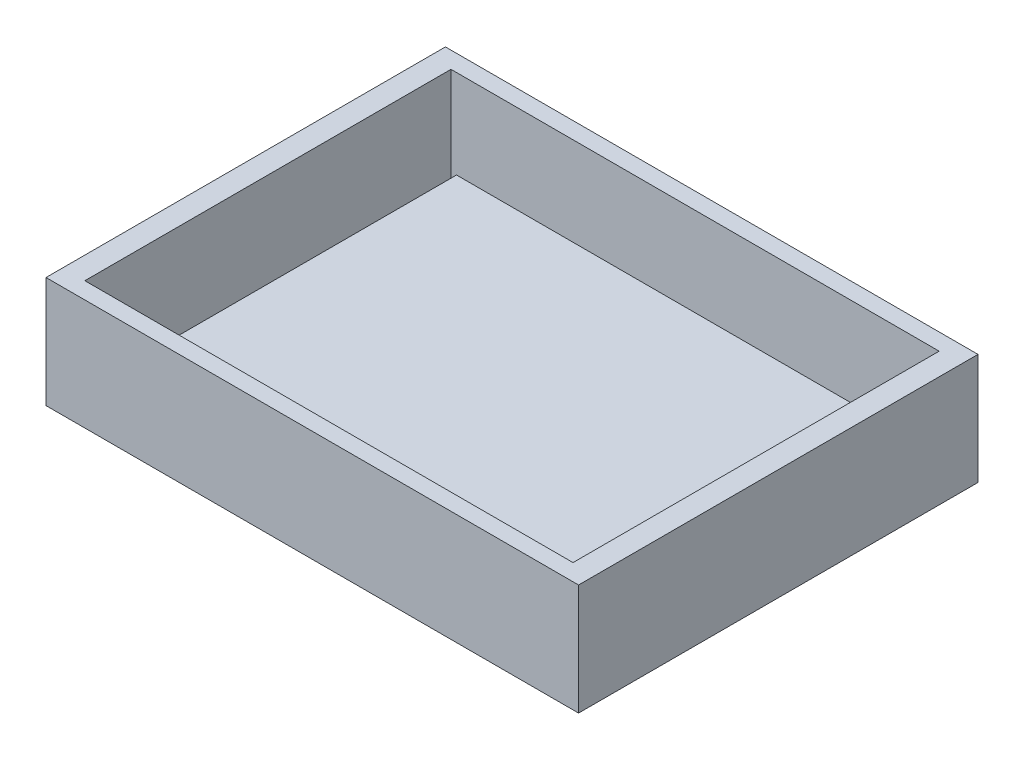
ISO-10303-21;
HEADER;
FILE_DESCRIPTION(('STEP AP214'),'2;1');
FILE_NAME('part.step','',(''),(''),'','','');
FILE_SCHEMA(('AUTOMOTIVE_DESIGN { 1 0 10303 214 1 1 1 1 }'));
ENDSEC;
DATA;
#1=APPLICATION_CONTEXT('core data for automotive mechanical design processes');
#2=APPLICATION_PROTOCOL_DEFINITION('international standard','automotive_design',2000,#1);
#3=PRODUCT_CONTEXT('',#1,'mechanical');
#4=PRODUCT('Part','Part','',(#3));
#5=PRODUCT_RELATED_PRODUCT_CATEGORY('part','',(#4));
#6=PRODUCT_DEFINITION_FORMATION('','',#4);
#7=PRODUCT_DEFINITION_CONTEXT('part definition',#1,'design');
#8=PRODUCT_DEFINITION('design','',#6,#7);
#9=PRODUCT_DEFINITION_SHAPE('','',#8);
#10=(LENGTH_UNIT() NAMED_UNIT(*) SI_UNIT(.MILLI.,.METRE.));
#11=(NAMED_UNIT(*) PLANE_ANGLE_UNIT() SI_UNIT($,.RADIAN.));
#12=(NAMED_UNIT(*) SI_UNIT($,.STERADIAN.) SOLID_ANGLE_UNIT());
#13=UNCERTAINTY_MEASURE_WITH_UNIT(LENGTH_MEASURE(1.E-05),#10,'distance_accuracy_value','');
#14=(GEOMETRIC_REPRESENTATION_CONTEXT(3) GLOBAL_UNCERTAINTY_ASSIGNED_CONTEXT((#13)) GLOBAL_UNIT_ASSIGNED_CONTEXT((#10,
#11,#12)) REPRESENTATION_CONTEXT('',''));
#15=CARTESIAN_POINT('',(0.,0.,0.));
#16=DIRECTION('',(0.,0.,1.));
#17=DIRECTION('',(1.,0.,0.));
#18=AXIS2_PLACEMENT_3D('',#15,#16,#17);
#19=CARTESIAN_POINT('',(0.,2.,0.));
#20=DIRECTION('',(0.,1.,0.));
#21=DIRECTION('',(0.,0.,1.));
#22=AXIS2_PLACEMENT_3D('',#19,#20,#21);
#23=PLANE('',#22);
#24=DIRECTION('',(0.,0.,1.));
#25=VECTOR('',#24,1.);
#26=CARTESIAN_POINT('',(-38.1666666666666,2.,-35.4444444444444));
#27=LINE('',#26,#25);
#28=CARTESIAN_POINT('',(-38.1666666666666,2.,-35.4444444444444));
#29=VERTEX_POINT('',#28);
#30=CARTESIAN_POINT('',(-38.1666666666666,2.,30.5555555555556));
#31=VERTEX_POINT('',#30);
#32=EDGE_CURVE('E156',#29,#31,#27,.T.);
#33=ORIENTED_EDGE('',*,*,#32,.T.);
#34=DIRECTION('',(1.,0.,0.));
#35=VECTOR('',#34,1.);
#36=CARTESIAN_POINT('',(-38.1666666666666,2.,30.5555555555556));
#37=LINE('',#36,#35);
#38=CARTESIAN_POINT('',(49.8333333333334,2.,30.5555555555556));
#39=VERTEX_POINT('',#38);
#40=EDGE_CURVE('E159',#31,#39,#37,.T.);
#41=ORIENTED_EDGE('',*,*,#40,.T.);
#42=DIRECTION('',(0.,0.,-1.));
#43=VECTOR('',#42,1.);
#44=CARTESIAN_POINT('',(49.8333333333334,2.,-35.4444444444444));
#45=LINE('',#44,#43);
#46=CARTESIAN_POINT('',(49.8333333333334,2.,-35.4444444444444));
#47=VERTEX_POINT('',#46);
#48=EDGE_CURVE('E163',#39,#47,#45,.T.);
#49=ORIENTED_EDGE('',*,*,#48,.T.);
#50=DIRECTION('',(-1.,0.,0.));
#51=VECTOR('',#50,1.);
#52=CARTESIAN_POINT('',(-38.1666666666666,2.,-35.4444444444444));
#53=LINE('',#52,#51);
#54=EDGE_CURVE('E166',#47,#29,#53,.T.);
#55=ORIENTED_EDGE('',*,*,#54,.T.);
#56=EDGE_LOOP('',(#33,#41,#49,#55));
#57=FACE_BOUND('',#56,.T.);
#58=DIRECTION('',(1.,0.,0.));
#59=VECTOR('',#58,1.);
#60=CARTESIAN_POINT('',(-34.1666666666666,2.,27.5555555555556));
#61=LINE('',#60,#59);
#62=CARTESIAN_POINT('',(-34.1666666666666,2.,27.5555555555556));
#63=VERTEX_POINT('',#62);
#64=CARTESIAN_POINT('',(45.8333333333334,2.,27.5555555555556));
#65=VERTEX_POINT('',#64);
#66=EDGE_CURVE('E377',#63,#65,#61,.T.);
#67=ORIENTED_EDGE('',*,*,#66,.F.);
#68=DIRECTION('',(0.,0.,1.));
#69=VECTOR('',#68,1.);
#70=CARTESIAN_POINT('',(-34.1666666666666,2.,-32.4444444444444));
#71=LINE('',#70,#69);
#72=CARTESIAN_POINT('',(-34.1666666666666,2.,-32.4444444444444));
#73=VERTEX_POINT('',#72);
#74=EDGE_CURVE('E148',#73,#63,#71,.T.);
#75=ORIENTED_EDGE('',*,*,#74,.F.);
#76=DIRECTION('',(-1.,0.,0.));
#77=VECTOR('',#76,1.);
#78=CARTESIAN_POINT('',(-34.1666666666666,2.,-32.4444444444444));
#79=LINE('',#78,#77);
#80=CARTESIAN_POINT('',(45.8333333333334,2.,-32.4444444444444));
#81=VERTEX_POINT('',#80);
#82=EDGE_CURVE('E144',#81,#73,#79,.T.);
#83=ORIENTED_EDGE('',*,*,#82,.F.);
#84=DIRECTION('',(0.,0.,-1.));
#85=VECTOR('',#84,1.);
#86=CARTESIAN_POINT('',(45.8333333333334,2.,-32.4444444444444));
#87=LINE('',#86,#85);
#88=EDGE_CURVE('E374',#65,#81,#87,.T.);
#89=ORIENTED_EDGE('',*,*,#88,.F.);
#90=EDGE_LOOP('',(#67,#75,#83,#89));
#91=FACE_BOUND('',#90,.T.);
#92=ADVANCED_FACE('F35',(#57,#91),#23,.T.);
#93=CARTESIAN_POINT('',(-42.1666666666666,20.,33.5555555555555));
#94=DIRECTION('',(-1.,0.,0.));
#95=DIRECTION('',(0.,0.,1.));
#96=AXIS2_PLACEMENT_3D('',#93,#94,#95);
#97=PLANE('',#96);
#98=DIRECTION('',(0.,0.,-1.));
#99=VECTOR('',#98,1.);
#100=CARTESIAN_POINT('',(-42.1666666666666,0.,33.5555555555555));
#101=LINE('',#100,#99);
#102=CARTESIAN_POINT('',(-42.1666666666666,0.,33.5555555555555));
#103=VERTEX_POINT('',#102);
#104=CARTESIAN_POINT('',(-42.1666666666666,0.,-38.4444444444445));
#105=VERTEX_POINT('',#104);
#106=EDGE_CURVE('E179',#103,#105,#101,.T.);
#107=ORIENTED_EDGE('',*,*,#106,.F.);
#108=DIRECTION('',(0.,-1.,0.));
#109=VECTOR('',#108,1.);
#110=CARTESIAN_POINT('',(-42.1666666666666,20.,33.5555555555555));
#111=LINE('',#110,#109);
#112=CARTESIAN_POINT('',(-42.1666666666666,20.,33.5555555555555));
#113=VERTEX_POINT('',#112);
#114=EDGE_CURVE('E11',#113,#103,#111,.T.);
#115=ORIENTED_EDGE('',*,*,#114,.F.);
#116=DIRECTION('',(0.,0.,-1.));
#117=VECTOR('',#116,1.);
#118=CARTESIAN_POINT('',(-42.1666666666666,20.,33.5555555555555));
#119=LINE('',#118,#117);
#120=CARTESIAN_POINT('',(-42.1666666666666,20.,-38.4444444444445));
#121=VERTEX_POINT('',#120);
#122=EDGE_CURVE('E185',#113,#121,#119,.T.);
#123=ORIENTED_EDGE('',*,*,#122,.T.);
#124=DIRECTION('',(0.,-1.,0.));
#125=VECTOR('',#124,1.);
#126=CARTESIAN_POINT('',(-42.1666666666666,20.,-38.4444444444445));
#127=LINE('',#126,#125);
#128=EDGE_CURVE('E39',#121,#105,#127,.T.);
#129=ORIENTED_EDGE('',*,*,#128,.T.);
#130=EDGE_LOOP('',(#107,#115,#123,#129));
#131=FACE_BOUND('',#130,.T.);
#132=ADVANCED_FACE('F212',(#131),#97,.T.);
#133=CARTESIAN_POINT('',(-42.1666666666666,20.,33.5555555555555));
#134=DIRECTION('',(0.,0.,-1.));
#135=DIRECTION('',(-1.,0.,0.));
#136=AXIS2_PLACEMENT_3D('',#133,#134,#135);
#137=PLANE('',#136);
#138=DIRECTION('',(1.,0.,0.));
#139=VECTOR('',#138,1.);
#140=CARTESIAN_POINT('',(-42.1666666666666,0.,33.5555555555555));
#141=LINE('',#140,#139);
#142=CARTESIAN_POINT('',(53.8333333333334,0.,33.5555555555555));
#143=VERTEX_POINT('',#142);
#144=EDGE_CURVE('E189',#103,#143,#141,.T.);
#145=ORIENTED_EDGE('',*,*,#144,.T.);
#146=DIRECTION('',(0.,-1.,0.));
#147=VECTOR('',#146,1.);
#148=CARTESIAN_POINT('',(53.8333333333334,20.,33.5555555555555));
#149=LINE('',#148,#147);
#150=CARTESIAN_POINT('',(53.8333333333334,20.,33.5555555555555));
#151=VERTEX_POINT('',#150);
#152=EDGE_CURVE('E44',#151,#143,#149,.T.);
#153=ORIENTED_EDGE('',*,*,#152,.F.);
#154=DIRECTION('',(1.,0.,0.));
#155=VECTOR('',#154,1.);
#156=CARTESIAN_POINT('',(-42.1666666666666,20.,33.5555555555555));
#157=LINE('',#156,#155);
#158=EDGE_CURVE('E194',#113,#151,#157,.T.);
#159=ORIENTED_EDGE('',*,*,#158,.F.);
#160=ORIENTED_EDGE('',*,*,#114,.T.);
#161=EDGE_LOOP('',(#145,#153,#159,#160));
#162=FACE_BOUND('',#161,.T.);
#163=ADVANCED_FACE('F221',(#162),#137,.F.);
#164=CARTESIAN_POINT('',(53.8333333333334,20.,33.5555555555555));
#165=DIRECTION('',(-1.,0.,0.));
#166=DIRECTION('',(0.,0.,1.));
#167=AXIS2_PLACEMENT_3D('',#164,#165,#166);
#168=PLANE('',#167);
#169=DIRECTION('',(0.,0.,-1.));
#170=VECTOR('',#169,1.);
#171=CARTESIAN_POINT('',(53.8333333333334,0.,33.5555555555555));
#172=LINE('',#171,#170);
#173=CARTESIAN_POINT('',(53.8333333333334,0.,-38.4444444444445));
#174=VERTEX_POINT('',#173);
#175=EDGE_CURVE('E201',#143,#174,#172,.T.);
#176=ORIENTED_EDGE('',*,*,#175,.T.);
#177=DIRECTION('',(0.,-1.,0.));
#178=VECTOR('',#177,1.);
#179=CARTESIAN_POINT('',(53.8333333333334,20.,-38.4444444444445));
#180=LINE('',#179,#178);
#181=CARTESIAN_POINT('',(53.8333333333334,20.,-38.4444444444445));
#182=VERTEX_POINT('',#181);
#183=EDGE_CURVE('E206',#182,#174,#180,.T.);
#184=ORIENTED_EDGE('',*,*,#183,.F.);
#185=DIRECTION('',(0.,0.,-1.));
#186=VECTOR('',#185,1.);
#187=CARTESIAN_POINT('',(53.8333333333334,20.,33.5555555555555));
#188=LINE('',#187,#186);
#189=EDGE_CURVE('E192',#151,#182,#188,.T.);
#190=ORIENTED_EDGE('',*,*,#189,.F.);
#191=ORIENTED_EDGE('',*,*,#152,.T.);
#192=EDGE_LOOP('',(#176,#184,#190,#191));
#193=FACE_BOUND('',#192,.T.);
#194=ADVANCED_FACE('F225',(#193),#168,.F.);
#195=CARTESIAN_POINT('',(-42.1666666666666,20.,-38.4444444444445));
#196=DIRECTION('',(0.,0.,-1.));
#197=DIRECTION('',(-1.,0.,0.));
#198=AXIS2_PLACEMENT_3D('',#195,#196,#197);
#199=PLANE('',#198);
#200=DIRECTION('',(1.,0.,0.));
#201=VECTOR('',#200,1.);
#202=CARTESIAN_POINT('',(-42.1666666666666,0.,-38.4444444444445));
#203=LINE('',#202,#201);
#204=EDGE_CURVE('E198',#105,#174,#203,.T.);
#205=ORIENTED_EDGE('',*,*,#204,.F.);
#206=ORIENTED_EDGE('',*,*,#128,.F.);
#207=DIRECTION('',(1.,0.,0.));
#208=VECTOR('',#207,1.);
#209=CARTESIAN_POINT('',(-42.1666666666666,20.,-38.4444444444445));
#210=LINE('',#209,#208);
#211=EDGE_CURVE('E188',#121,#182,#210,.T.);
#212=ORIENTED_EDGE('',*,*,#211,.T.);
#213=ORIENTED_EDGE('',*,*,#183,.T.);
#214=EDGE_LOOP('',(#205,#206,#212,#213));
#215=FACE_BOUND('',#214,.T.);
#216=ADVANCED_FACE('F215',(#215),#199,.T.);
#217=CARTESIAN_POINT('',(0.,20.,0.));
#218=DIRECTION('',(0.,-1.,0.));
#219=DIRECTION('',(0.,0.,-1.));
#220=AXIS2_PLACEMENT_3D('',#217,#218,#219);
#221=PLANE('',#220);
#222=DIRECTION('',(1.,0.,0.));
#223=VECTOR('',#222,1.);
#224=CARTESIAN_POINT('',(-38.1666666666666,20.,30.5555555555556));
#225=LINE('',#224,#223);
#226=CARTESIAN_POINT('',(-38.1666666666666,20.,30.5555555555556));
#227=VERTEX_POINT('',#226);
#228=CARTESIAN_POINT('',(49.8333333333334,20.,30.5555555555556));
#229=VERTEX_POINT('',#228);
#230=EDGE_CURVE('E151',#227,#229,#225,.T.);
#231=ORIENTED_EDGE('',*,*,#230,.F.);
#232=DIRECTION('',(0.,0.,1.));
#233=VECTOR('',#232,1.);
#234=CARTESIAN_POINT('',(-38.1666666666666,20.,-35.4444444444444));
#235=LINE('',#234,#233);
#236=CARTESIAN_POINT('',(-38.1666666666666,20.,-35.4444444444444));
#237=VERTEX_POINT('',#236);
#238=EDGE_CURVE('E60',#237,#227,#235,.T.);
#239=ORIENTED_EDGE('',*,*,#238,.F.);
#240=DIRECTION('',(-1.,0.,0.));
#241=VECTOR('',#240,1.);
#242=CARTESIAN_POINT('',(-38.1666666666666,20.,-35.4444444444444));
#243=LINE('',#242,#241);
#244=CARTESIAN_POINT('',(49.8333333333334,20.,-35.4444444444444));
#245=VERTEX_POINT('',#244);
#246=EDGE_CURVE('E160',#245,#237,#243,.T.);
#247=ORIENTED_EDGE('',*,*,#246,.F.);
#248=DIRECTION('',(0.,0.,-1.));
#249=VECTOR('',#248,1.);
#250=CARTESIAN_POINT('',(49.8333333333334,20.,-35.4444444444444));
#251=LINE('',#250,#249);
#252=EDGE_CURVE('E172',#229,#245,#251,.T.);
#253=ORIENTED_EDGE('',*,*,#252,.F.);
#254=EDGE_LOOP('',(#231,#239,#247,#253));
#255=FACE_BOUND('',#254,.T.);
#256=ORIENTED_EDGE('',*,*,#122,.F.);
#257=ORIENTED_EDGE('',*,*,#158,.T.);
#258=ORIENTED_EDGE('',*,*,#189,.T.);
#259=ORIENTED_EDGE('',*,*,#211,.F.);
#260=EDGE_LOOP('',(#256,#257,#258,#259));
#261=FACE_BOUND('',#260,.T.);
#262=ADVANCED_FACE('F227',(#255,#261),#221,.F.);
#263=CARTESIAN_POINT('',(0.,0.,0.));
#264=DIRECTION('',(0.,1.,0.));
#265=DIRECTION('',(0.,0.,1.));
#266=AXIS2_PLACEMENT_3D('',#263,#264,#265);
#267=PLANE('',#266);
#268=ORIENTED_EDGE('',*,*,#106,.T.);
#269=ORIENTED_EDGE('',*,*,#204,.T.);
#270=ORIENTED_EDGE('',*,*,#175,.F.);
#271=ORIENTED_EDGE('',*,*,#144,.F.);
#272=EDGE_LOOP('',(#268,#269,#270,#271));
#273=FACE_BOUND('',#272,.T.);
#274=ADVANCED_FACE('F37',(#273),#267,.F.);
#275=CARTESIAN_POINT('',(-38.1666666666666,2.,-35.4444444444444));
#276=DIRECTION('',(-1.,0.,0.));
#277=DIRECTION('',(0.,0.,1.));
#278=AXIS2_PLACEMENT_3D('',#275,#276,#277);
#279=PLANE('',#278);
#280=ORIENTED_EDGE('',*,*,#238,.T.);
#281=DIRECTION('',(0.,1.,0.));
#282=VECTOR('',#281,1.);
#283=CARTESIAN_POINT('',(-38.1666666666666,2.,30.5555555555556));
#284=LINE('',#283,#282);
#285=EDGE_CURVE('E168',#31,#227,#284,.T.);
#286=ORIENTED_EDGE('',*,*,#285,.F.);
#287=ORIENTED_EDGE('',*,*,#32,.F.);
#288=DIRECTION('',(0.,1.,0.));
#289=VECTOR('',#288,1.);
#290=CARTESIAN_POINT('',(-38.1666666666666,2.,-35.4444444444444));
#291=LINE('',#290,#289);
#292=EDGE_CURVE('E177',#29,#237,#291,.T.);
#293=ORIENTED_EDGE('',*,*,#292,.T.);
#294=EDGE_LOOP('',(#280,#286,#287,#293));
#295=FACE_BOUND('',#294,.T.);
#296=ADVANCED_FACE('F235',(#295),#279,.F.);
#297=CARTESIAN_POINT('',(-38.1666666666666,2.,-35.4444444444444));
#298=DIRECTION('',(0.,0.,-1.));
#299=DIRECTION('',(-1.,0.,0.));
#300=AXIS2_PLACEMENT_3D('',#297,#298,#299);
#301=PLANE('',#300);
#302=ORIENTED_EDGE('',*,*,#246,.T.);
#303=ORIENTED_EDGE('',*,*,#292,.F.);
#304=ORIENTED_EDGE('',*,*,#54,.F.);
#305=DIRECTION('',(0.,1.,0.));
#306=VECTOR('',#305,1.);
#307=CARTESIAN_POINT('',(49.8333333333334,2.,-35.4444444444444));
#308=LINE('',#307,#306);
#309=EDGE_CURVE('E180',#47,#245,#308,.T.);
#310=ORIENTED_EDGE('',*,*,#309,.T.);
#311=EDGE_LOOP('',(#302,#303,#304,#310));
#312=FACE_BOUND('',#311,.T.);
#313=ADVANCED_FACE('F250',(#312),#301,.F.);
#314=CARTESIAN_POINT('',(49.8333333333334,2.,-35.4444444444444));
#315=DIRECTION('',(1.,0.,0.));
#316=DIRECTION('',(0.,0.,-1.));
#317=AXIS2_PLACEMENT_3D('',#314,#315,#316);
#318=PLANE('',#317);
#319=ORIENTED_EDGE('',*,*,#252,.T.);
#320=ORIENTED_EDGE('',*,*,#309,.F.);
#321=ORIENTED_EDGE('',*,*,#48,.F.);
#322=DIRECTION('',(0.,1.,0.));
#323=VECTOR('',#322,1.);
#324=CARTESIAN_POINT('',(49.8333333333334,2.,30.5555555555556));
#325=LINE('',#324,#323);
#326=EDGE_CURVE('E182',#39,#229,#325,.T.);
#327=ORIENTED_EDGE('',*,*,#326,.T.);
#328=EDGE_LOOP('',(#319,#320,#321,#327));
#329=FACE_BOUND('',#328,.T.);
#330=ADVANCED_FACE('F253',(#329),#318,.F.);
#331=CARTESIAN_POINT('',(-38.1666666666666,2.,30.5555555555556));
#332=DIRECTION('',(0.,0.,1.));
#333=DIRECTION('',(1.,0.,0.));
#334=AXIS2_PLACEMENT_3D('',#331,#332,#333);
#335=PLANE('',#334);
#336=ORIENTED_EDGE('',*,*,#230,.T.);
#337=ORIENTED_EDGE('',*,*,#326,.F.);
#338=ORIENTED_EDGE('',*,*,#40,.F.);
#339=ORIENTED_EDGE('',*,*,#285,.T.);
#340=EDGE_LOOP('',(#336,#337,#338,#339));
#341=FACE_BOUND('',#340,.T.);
#342=ADVANCED_FACE('F257',(#341),#335,.F.);
#343=CARTESIAN_POINT('',(-34.1666666666666,7.,-32.4444444444444));
#344=DIRECTION('',(1.,0.,0.));
#345=DIRECTION('',(0.,0.,-1.));
#346=AXIS2_PLACEMENT_3D('',#343,#344,#345);
#347=PLANE('',#346);
#348=ORIENTED_EDGE('',*,*,#74,.T.);
#349=DIRECTION('',(0.,-1.,0.));
#350=VECTOR('',#349,1.);
#351=CARTESIAN_POINT('',(-34.1666666666666,7.,27.5555555555556));
#352=LINE('',#351,#350);
#353=CARTESIAN_POINT('',(-34.1666666666666,7.,27.5555555555556));
#354=VERTEX_POINT('',#353);
#355=EDGE_CURVE('E129',#354,#63,#352,.T.);
#356=ORIENTED_EDGE('',*,*,#355,.F.);
#357=DIRECTION('',(0.,0.,1.));
#358=VECTOR('',#357,1.);
#359=CARTESIAN_POINT('',(-34.1666666666666,7.,-32.4444444444444));
#360=LINE('',#359,#358);
#361=CARTESIAN_POINT('',(-34.1666666666666,7.,-32.4444444444444));
#362=VERTEX_POINT('',#361);
#363=EDGE_CURVE('E136',#362,#354,#360,.T.);
#364=ORIENTED_EDGE('',*,*,#363,.F.);
#365=DIRECTION('',(0.,-1.,0.));
#366=VECTOR('',#365,1.);
#367=CARTESIAN_POINT('',(-34.1666666666666,7.,-32.4444444444444));
#368=LINE('',#367,#366);
#369=EDGE_CURVE('E372',#362,#73,#368,.T.);
#370=ORIENTED_EDGE('',*,*,#369,.T.);
#371=EDGE_LOOP('',(#348,#356,#364,#370));
#372=FACE_BOUND('',#371,.T.);
#373=ADVANCED_FACE('F146',(#372),#347,.F.);
#374=CARTESIAN_POINT('',(-34.1666666666666,7.,27.5555555555556));
#375=DIRECTION('',(0.,0.,-1.));
#376=DIRECTION('',(-1.,0.,0.));
#377=AXIS2_PLACEMENT_3D('',#374,#375,#376);
#378=PLANE('',#377);
#379=ORIENTED_EDGE('',*,*,#66,.T.);
#380=DIRECTION('',(0.,-1.,0.));
#381=VECTOR('',#380,1.);
#382=CARTESIAN_POINT('',(45.8333333333334,7.,27.5555555555556));
#383=LINE('',#382,#381);
#384=CARTESIAN_POINT('',(45.8333333333334,7.,27.5555555555556));
#385=VERTEX_POINT('',#384);
#386=EDGE_CURVE('E132',#385,#65,#383,.T.);
#387=ORIENTED_EDGE('',*,*,#386,.F.);
#388=DIRECTION('',(1.,0.,0.));
#389=VECTOR('',#388,1.);
#390=CARTESIAN_POINT('',(-34.1666666666666,7.,27.5555555555556));
#391=LINE('',#390,#389);
#392=EDGE_CURVE('E125',#354,#385,#391,.T.);
#393=ORIENTED_EDGE('',*,*,#392,.F.);
#394=ORIENTED_EDGE('',*,*,#355,.T.);
#395=EDGE_LOOP('',(#379,#387,#393,#394));
#396=FACE_BOUND('',#395,.T.);
#397=ADVANCED_FACE('F127',(#396),#378,.F.);
#398=CARTESIAN_POINT('',(45.8333333333334,7.,-32.4444444444444));
#399=DIRECTION('',(-1.,0.,0.));
#400=DIRECTION('',(0.,0.,1.));
#401=AXIS2_PLACEMENT_3D('',#398,#399,#400);
#402=PLANE('',#401);
#403=ORIENTED_EDGE('',*,*,#88,.T.);
#404=DIRECTION('',(0.,-1.,0.));
#405=VECTOR('',#404,1.);
#406=CARTESIAN_POINT('',(45.8333333333334,7.,-32.4444444444444));
#407=LINE('',#406,#405);
#408=CARTESIAN_POINT('',(45.8333333333334,7.,-32.4444444444444));
#409=VERTEX_POINT('',#408);
#410=EDGE_CURVE('E52',#409,#81,#407,.T.);
#411=ORIENTED_EDGE('',*,*,#410,.F.);
#412=DIRECTION('',(0.,0.,-1.));
#413=VECTOR('',#412,1.);
#414=CARTESIAN_POINT('',(45.8333333333334,7.,-32.4444444444444));
#415=LINE('',#414,#413);
#416=EDGE_CURVE('E135',#385,#409,#415,.T.);
#417=ORIENTED_EDGE('',*,*,#416,.F.);
#418=ORIENTED_EDGE('',*,*,#386,.T.);
#419=EDGE_LOOP('',(#403,#411,#417,#418));
#420=FACE_BOUND('',#419,.T.);
#421=ADVANCED_FACE('F289',(#420),#402,.F.);
#422=CARTESIAN_POINT('',(-34.1666666666666,7.,-32.4444444444444));
#423=DIRECTION('',(0.,0.,1.));
#424=DIRECTION('',(1.,0.,0.));
#425=AXIS2_PLACEMENT_3D('',#422,#423,#424);
#426=PLANE('',#425);
#427=ORIENTED_EDGE('',*,*,#82,.T.);
#428=ORIENTED_EDGE('',*,*,#369,.F.);
#429=DIRECTION('',(-1.,0.,0.));
#430=VECTOR('',#429,1.);
#431=CARTESIAN_POINT('',(-34.1666666666666,7.,-32.4444444444444));
#432=LINE('',#431,#430);
#433=EDGE_CURVE('E140',#409,#362,#432,.T.);
#434=ORIENTED_EDGE('',*,*,#433,.F.);
#435=ORIENTED_EDGE('',*,*,#410,.T.);
#436=EDGE_LOOP('',(#427,#428,#434,#435));
#437=FACE_BOUND('',#436,.T.);
#438=ADVANCED_FACE('F295',(#437),#426,.F.);
#439=CARTESIAN_POINT('',(0.,7.,0.));
#440=DIRECTION('',(0.,1.,0.));
#441=DIRECTION('',(0.,0.,1.));
#442=AXIS2_PLACEMENT_3D('',#439,#440,#441);
#443=PLANE('',#442);
#444=ORIENTED_EDGE('',*,*,#363,.T.);
#445=ORIENTED_EDGE('',*,*,#392,.T.);
#446=ORIENTED_EDGE('',*,*,#416,.T.);
#447=ORIENTED_EDGE('',*,*,#433,.T.);
#448=EDGE_LOOP('',(#444,#445,#446,#447));
#449=FACE_BOUND('',#448,.T.);
#450=ADVANCED_FACE('F139',(#449),#443,.T.);
#451=CLOSED_SHELL('',(#92,#132,#163,#194,#216,#262,#274,#296,#313,#330,#342,#373,#397,#421,#438,#450));
#452=MANIFOLD_SOLID_BREP('B2',#451);
#453=ADVANCED_BREP_SHAPE_REPRESENTATION('',(#18,#452),#14);
#454=SHAPE_DEFINITION_REPRESENTATION(#9,#453);
ENDSEC;
END-ISO-10303-21;
